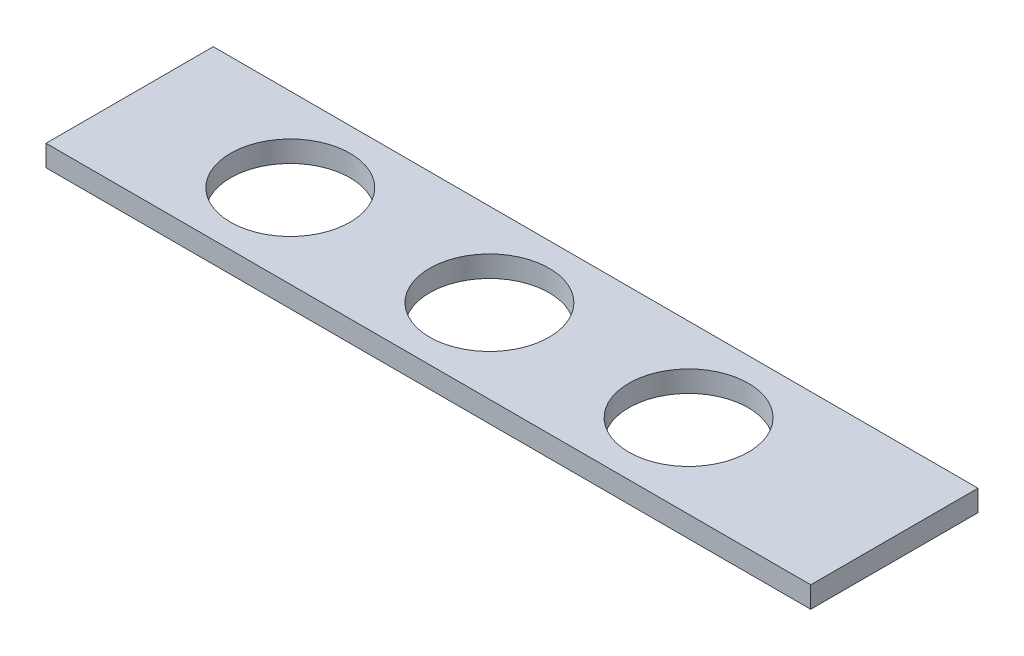
ISO-10303-21;
HEADER;
FILE_DESCRIPTION(('STEP AP214'),'2;1');
FILE_NAME('part.step','',(''),(''),'','','');
FILE_SCHEMA(('AUTOMOTIVE_DESIGN { 1 0 10303 214 1 1 1 1 }'));
ENDSEC;
DATA;
#1=APPLICATION_CONTEXT('core data for automotive mechanical design processes');
#2=APPLICATION_PROTOCOL_DEFINITION('international standard','automotive_design',2000,#1);
#3=PRODUCT_CONTEXT('',#1,'mechanical');
#4=PRODUCT('Part','Part','',(#3));
#5=PRODUCT_RELATED_PRODUCT_CATEGORY('part','',(#4));
#6=PRODUCT_DEFINITION_FORMATION('','',#4);
#7=PRODUCT_DEFINITION_CONTEXT('part definition',#1,'design');
#8=PRODUCT_DEFINITION('design','',#6,#7);
#9=PRODUCT_DEFINITION_SHAPE('','',#8);
#10=(LENGTH_UNIT() NAMED_UNIT(*) SI_UNIT(.MILLI.,.METRE.));
#11=(NAMED_UNIT(*) PLANE_ANGLE_UNIT() SI_UNIT($,.RADIAN.));
#12=(NAMED_UNIT(*) SI_UNIT($,.STERADIAN.) SOLID_ANGLE_UNIT());
#13=UNCERTAINTY_MEASURE_WITH_UNIT(LENGTH_MEASURE(1.E-05),#10,'distance_accuracy_value','');
#14=(GEOMETRIC_REPRESENTATION_CONTEXT(3) GLOBAL_UNCERTAINTY_ASSIGNED_CONTEXT((#13)) GLOBAL_UNIT_ASSIGNED_CONTEXT((#10,
#11,#12)) REPRESENTATION_CONTEXT('',''));
#15=CARTESIAN_POINT('',(0.,0.,0.));
#16=DIRECTION('',(0.,0.,1.));
#17=DIRECTION('',(1.,0.,0.));
#18=AXIS2_PLACEMENT_3D('',#15,#16,#17);
#19=CARTESIAN_POINT('',(0.,8.,-63.));
#20=DIRECTION('',(0.,0.,-1.));
#21=DIRECTION('',(-1.,0.,0.));
#22=AXIS2_PLACEMENT_3D('',#19,#20,#21);
#23=PLANE('',#22);
#24=DIRECTION('',(1.,0.,0.));
#25=VECTOR('',#24,1.);
#26=CARTESIAN_POINT('',(0.,0.,-63.));
#27=LINE('',#26,#25);
#28=CARTESIAN_POINT('',(0.,0.,-63.));
#29=VERTEX_POINT('',#28);
#30=CARTESIAN_POINT('',(288.,0.,-63.));
#31=VERTEX_POINT('',#30);
#32=EDGE_CURVE('E110',#29,#31,#27,.T.);
#33=ORIENTED_EDGE('',*,*,#32,.F.);
#34=DIRECTION('',(0.,-1.,0.));
#35=VECTOR('',#34,1.);
#36=CARTESIAN_POINT('',(0.,8.,-63.));
#37=LINE('',#36,#35);
#38=CARTESIAN_POINT('',(0.,8.,-63.));
#39=VERTEX_POINT('',#38);
#40=EDGE_CURVE('E11',#39,#29,#37,.T.);
#41=ORIENTED_EDGE('',*,*,#40,.F.);
#42=DIRECTION('',(1.,0.,0.));
#43=VECTOR('',#42,1.);
#44=CARTESIAN_POINT('',(0.,8.,-63.));
#45=LINE('',#44,#43);
#46=CARTESIAN_POINT('',(288.,8.,-63.));
#47=VERTEX_POINT('',#46);
#48=EDGE_CURVE('E101',#39,#47,#45,.T.);
#49=ORIENTED_EDGE('',*,*,#48,.T.);
#50=DIRECTION('',(0.,-1.,0.));
#51=VECTOR('',#50,1.);
#52=CARTESIAN_POINT('',(288.,8.,-63.));
#53=LINE('',#52,#51);
#54=EDGE_CURVE('E42',#47,#31,#53,.T.);
#55=ORIENTED_EDGE('',*,*,#54,.T.);
#56=EDGE_LOOP('',(#33,#41,#49,#55));
#57=FACE_BOUND('',#56,.T.);
#58=ADVANCED_FACE('F39',(#57),#23,.T.);
#59=CARTESIAN_POINT('',(0.,8.,0.));
#60=DIRECTION('',(-1.,0.,0.));
#61=DIRECTION('',(0.,0.,1.));
#62=AXIS2_PLACEMENT_3D('',#59,#60,#61);
#63=PLANE('',#62);
#64=DIRECTION('',(0.,0.,-1.));
#65=VECTOR('',#64,1.);
#66=CARTESIAN_POINT('',(0.,0.,0.));
#67=LINE('',#66,#65);
#68=CARTESIAN_POINT('',(0.,0.,0.));
#69=VERTEX_POINT('',#68);
#70=EDGE_CURVE('E104',#69,#29,#67,.T.);
#71=ORIENTED_EDGE('',*,*,#70,.F.);
#72=DIRECTION('',(0.,-1.,0.));
#73=VECTOR('',#72,1.);
#74=CARTESIAN_POINT('',(0.,8.,0.));
#75=LINE('',#74,#73);
#76=CARTESIAN_POINT('',(0.,8.,0.));
#77=VERTEX_POINT('',#76);
#78=EDGE_CURVE('E49',#77,#69,#75,.T.);
#79=ORIENTED_EDGE('',*,*,#78,.F.);
#80=DIRECTION('',(0.,0.,-1.));
#81=VECTOR('',#80,1.);
#82=CARTESIAN_POINT('',(0.,8.,0.));
#83=LINE('',#82,#81);
#84=EDGE_CURVE('E88',#77,#39,#83,.T.);
#85=ORIENTED_EDGE('',*,*,#84,.T.);
#86=ORIENTED_EDGE('',*,*,#40,.T.);
#87=EDGE_LOOP('',(#71,#79,#85,#86));
#88=FACE_BOUND('',#87,.T.);
#89=ADVANCED_FACE('F127',(#88),#63,.T.);
#90=CARTESIAN_POINT('',(0.,8.,0.));
#91=DIRECTION('',(0.,0.,-1.));
#92=DIRECTION('',(-1.,0.,0.));
#93=AXIS2_PLACEMENT_3D('',#90,#91,#92);
#94=PLANE('',#93);
#95=DIRECTION('',(1.,0.,0.));
#96=VECTOR('',#95,1.);
#97=CARTESIAN_POINT('',(0.,0.,0.));
#98=LINE('',#97,#96);
#99=CARTESIAN_POINT('',(288.,0.,0.));
#100=VERTEX_POINT('',#99);
#101=EDGE_CURVE('E94',#69,#100,#98,.T.);
#102=ORIENTED_EDGE('',*,*,#101,.T.);
#103=DIRECTION('',(0.,-1.,0.));
#104=VECTOR('',#103,1.);
#105=CARTESIAN_POINT('',(288.,8.,0.));
#106=LINE('',#105,#104);
#107=CARTESIAN_POINT('',(288.,8.,0.));
#108=VERTEX_POINT('',#107);
#109=EDGE_CURVE('E92',#108,#100,#106,.T.);
#110=ORIENTED_EDGE('',*,*,#109,.F.);
#111=DIRECTION('',(1.,0.,0.));
#112=VECTOR('',#111,1.);
#113=CARTESIAN_POINT('',(0.,8.,0.));
#114=LINE('',#113,#112);
#115=EDGE_CURVE('E85',#77,#108,#114,.T.);
#116=ORIENTED_EDGE('',*,*,#115,.F.);
#117=ORIENTED_EDGE('',*,*,#78,.T.);
#118=EDGE_LOOP('',(#102,#110,#116,#117));
#119=FACE_BOUND('',#118,.T.);
#120=ADVANCED_FACE('F93',(#119),#94,.F.);
#121=CARTESIAN_POINT('',(288.,8.,0.));
#122=DIRECTION('',(-1.,0.,0.));
#123=DIRECTION('',(0.,0.,1.));
#124=AXIS2_PLACEMENT_3D('',#121,#122,#123);
#125=PLANE('',#124);
#126=DIRECTION('',(0.,0.,-1.));
#127=VECTOR('',#126,1.);
#128=CARTESIAN_POINT('',(288.,0.,0.));
#129=LINE('',#128,#127);
#130=EDGE_CURVE('E114',#100,#31,#129,.T.);
#131=ORIENTED_EDGE('',*,*,#130,.T.);
#132=ORIENTED_EDGE('',*,*,#54,.F.);
#133=DIRECTION('',(0.,0.,-1.));
#134=VECTOR('',#133,1.);
#135=CARTESIAN_POINT('',(288.,8.,0.));
#136=LINE('',#135,#134);
#137=EDGE_CURVE('E82',#108,#47,#136,.T.);
#138=ORIENTED_EDGE('',*,*,#137,.F.);
#139=ORIENTED_EDGE('',*,*,#109,.T.);
#140=EDGE_LOOP('',(#131,#132,#138,#139));
#141=FACE_BOUND('',#140,.T.);
#142=ADVANCED_FACE('F99',(#141),#125,.F.);
#143=CARTESIAN_POINT('',(0.,8.,0.));
#144=DIRECTION('',(0.,1.,0.));
#145=DIRECTION('',(0.,0.,1.));
#146=AXIS2_PLACEMENT_3D('',#143,#144,#145);
#147=PLANE('',#146);
#148=CARTESIAN_POINT('',(210.5,8.,-31.5));
#149=DIRECTION('',(0.,1.,0.));
#150=DIRECTION('',(0.,0.,1.));
#151=AXIS2_PLACEMENT_3D('',#148,#149,#150);
#152=CIRCLE('',#151,22.5);
#153=CARTESIAN_POINT('',(210.5,8.,-8.99999999999999));
#154=VERTEX_POINT('',#153);
#155=EDGE_CURVE('E167',#154,#154,#152,.T.);
#156=ORIENTED_EDGE('',*,*,#155,.F.);
#157=EDGE_LOOP('',(#156));
#158=FACE_BOUND('',#157,.T.);
#159=CARTESIAN_POINT('',(135.5,8.,-31.5));
#160=DIRECTION('',(0.,1.,0.));
#161=DIRECTION('',(0.,0.,1.));
#162=AXIS2_PLACEMENT_3D('',#159,#160,#161);
#163=CIRCLE('',#162,22.5);
#164=CARTESIAN_POINT('',(135.5,8.,-9.00000000000002));
#165=VERTEX_POINT('',#164);
#166=EDGE_CURVE('E171',#165,#165,#163,.T.);
#167=ORIENTED_EDGE('',*,*,#166,.F.);
#168=EDGE_LOOP('',(#167));
#169=FACE_BOUND('',#168,.T.);
#170=CARTESIAN_POINT('',(60.5,8.,-31.5));
#171=DIRECTION('',(0.,1.,0.));
#172=DIRECTION('',(0.,0.,1.));
#173=AXIS2_PLACEMENT_3D('',#170,#171,#172);
#174=CIRCLE('',#173,22.5);
#175=CARTESIAN_POINT('',(60.5,8.,-8.99999999999999));
#176=VERTEX_POINT('',#175);
#177=EDGE_CURVE('E178',#176,#176,#174,.T.);
#178=ORIENTED_EDGE('',*,*,#177,.F.);
#179=EDGE_LOOP('',(#178));
#180=FACE_BOUND('',#179,.T.);
#181=ORIENTED_EDGE('',*,*,#48,.F.);
#182=ORIENTED_EDGE('',*,*,#84,.F.);
#183=ORIENTED_EDGE('',*,*,#115,.T.);
#184=ORIENTED_EDGE('',*,*,#137,.T.);
#185=EDGE_LOOP('',(#181,#182,#183,#184));
#186=FACE_BOUND('',#185,.T.);
#187=ADVANCED_FACE('F87',(#158,#169,#180,#186),#147,.T.);
#188=CARTESIAN_POINT('',(0.,0.,0.));
#189=DIRECTION('',(0.,1.,0.));
#190=DIRECTION('',(0.,0.,1.));
#191=AXIS2_PLACEMENT_3D('',#188,#189,#190);
#192=PLANE('',#191);
#193=CARTESIAN_POINT('',(210.5,0.,-31.5));
#194=DIRECTION('',(0.,1.,0.));
#195=DIRECTION('',(0.,0.,1.));
#196=AXIS2_PLACEMENT_3D('',#193,#194,#195);
#197=CIRCLE('',#196,22.5);
#198=CARTESIAN_POINT('',(210.5,0.,-8.99999999999999));
#199=VERTEX_POINT('',#198);
#200=EDGE_CURVE('E165',#199,#199,#197,.T.);
#201=ORIENTED_EDGE('',*,*,#200,.T.);
#202=EDGE_LOOP('',(#201));
#203=FACE_BOUND('',#202,.T.);
#204=CARTESIAN_POINT('',(135.5,0.,-31.5));
#205=DIRECTION('',(0.,1.,0.));
#206=DIRECTION('',(0.,0.,1.));
#207=AXIS2_PLACEMENT_3D('',#204,#205,#206);
#208=CIRCLE('',#207,22.5);
#209=CARTESIAN_POINT('',(135.5,0.,-9.00000000000002));
#210=VERTEX_POINT('',#209);
#211=EDGE_CURVE('E174',#210,#210,#208,.T.);
#212=ORIENTED_EDGE('',*,*,#211,.T.);
#213=EDGE_LOOP('',(#212));
#214=FACE_BOUND('',#213,.T.);
#215=CARTESIAN_POINT('',(60.5,0.,-31.5));
#216=DIRECTION('',(0.,1.,0.));
#217=DIRECTION('',(0.,0.,1.));
#218=AXIS2_PLACEMENT_3D('',#215,#216,#217);
#219=CIRCLE('',#218,22.5);
#220=CARTESIAN_POINT('',(60.5,0.,-8.99999999999999));
#221=VERTEX_POINT('',#220);
#222=EDGE_CURVE('E115',#221,#221,#219,.T.);
#223=ORIENTED_EDGE('',*,*,#222,.T.);
#224=EDGE_LOOP('',(#223));
#225=FACE_BOUND('',#224,.T.);
#226=ORIENTED_EDGE('',*,*,#32,.T.);
#227=ORIENTED_EDGE('',*,*,#130,.F.);
#228=ORIENTED_EDGE('',*,*,#101,.F.);
#229=ORIENTED_EDGE('',*,*,#70,.T.);
#230=EDGE_LOOP('',(#226,#227,#228,#229));
#231=FACE_BOUND('',#230,.T.);
#232=ADVANCED_FACE('F126',(#203,#214,#225,#231),#192,.F.);
#233=CARTESIAN_POINT('',(60.5,0.,-31.5));
#234=DIRECTION('',(0.,1.,0.));
#235=DIRECTION('',(0.,0.,1.));
#236=AXIS2_PLACEMENT_3D('',#233,#234,#235);
#237=CYLINDRICAL_SURFACE('',#236,22.5);
#238=ORIENTED_EDGE('',*,*,#222,.F.);
#239=EDGE_LOOP('',(#238));
#240=FACE_BOUND('',#239,.T.);
#241=ORIENTED_EDGE('',*,*,#177,.T.);
#242=EDGE_LOOP('',(#241));
#243=FACE_BOUND('',#242,.T.);
#244=ADVANCED_FACE('F145',(#240,#243),#237,.F.);
#245=CARTESIAN_POINT('',(135.5,0.,-31.5));
#246=DIRECTION('',(0.,1.,0.));
#247=DIRECTION('',(0.,0.,1.));
#248=AXIS2_PLACEMENT_3D('',#245,#246,#247);
#249=CYLINDRICAL_SURFACE('',#248,22.5);
#250=ORIENTED_EDGE('',*,*,#211,.F.);
#251=EDGE_LOOP('',(#250));
#252=FACE_BOUND('',#251,.T.);
#253=ORIENTED_EDGE('',*,*,#166,.T.);
#254=EDGE_LOOP('',(#253));
#255=FACE_BOUND('',#254,.T.);
#256=ADVANCED_FACE('F152',(#252,#255),#249,.F.);
#257=CARTESIAN_POINT('',(210.5,0.,-31.5));
#258=DIRECTION('',(0.,1.,0.));
#259=DIRECTION('',(0.,0.,1.));
#260=AXIS2_PLACEMENT_3D('',#257,#258,#259);
#261=CYLINDRICAL_SURFACE('',#260,22.5);
#262=ORIENTED_EDGE('',*,*,#200,.F.);
#263=EDGE_LOOP('',(#262));
#264=FACE_BOUND('',#263,.T.);
#265=ORIENTED_EDGE('',*,*,#155,.T.);
#266=EDGE_LOOP('',(#265));
#267=FACE_BOUND('',#266,.T.);
#268=ADVANCED_FACE('F156',(#264,#267),#261,.F.);
#269=CLOSED_SHELL('',(#58,#89,#120,#142,#187,#232,#244,#256,#268));
#270=MANIFOLD_SOLID_BREP('B2',#269);
#271=ADVANCED_BREP_SHAPE_REPRESENTATION('',(#18,#270),#14);
#272=SHAPE_DEFINITION_REPRESENTATION(#9,#271);
ENDSEC;
END-ISO-10303-21;
